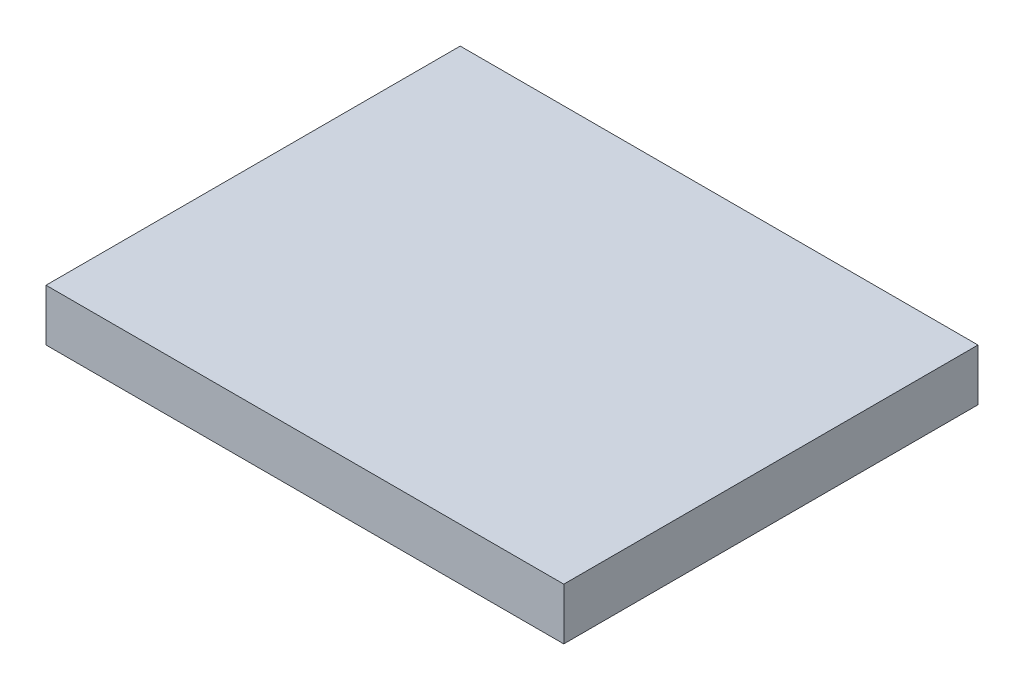
ISO-10303-21;
HEADER;
FILE_DESCRIPTION(('STEP AP214'),'2;1');
FILE_NAME('part.step','',(''),(''),'','','');
FILE_SCHEMA(('AUTOMOTIVE_DESIGN { 1 0 10303 214 1 1 1 1 }'));
ENDSEC;
DATA;
#1=APPLICATION_CONTEXT('core data for automotive mechanical design processes');
#2=APPLICATION_PROTOCOL_DEFINITION('international standard','automotive_design',2000,#1);
#3=PRODUCT_CONTEXT('',#1,'mechanical');
#4=PRODUCT('Part','Part','',(#3));
#5=PRODUCT_RELATED_PRODUCT_CATEGORY('part','',(#4));
#6=PRODUCT_DEFINITION_FORMATION('','',#4);
#7=PRODUCT_DEFINITION_CONTEXT('part definition',#1,'design');
#8=PRODUCT_DEFINITION('design','',#6,#7);
#9=PRODUCT_DEFINITION_SHAPE('','',#8);
#10=(LENGTH_UNIT() NAMED_UNIT(*) SI_UNIT(.MILLI.,.METRE.));
#11=(NAMED_UNIT(*) PLANE_ANGLE_UNIT() SI_UNIT($,.RADIAN.));
#12=(NAMED_UNIT(*) SI_UNIT($,.STERADIAN.) SOLID_ANGLE_UNIT());
#13=UNCERTAINTY_MEASURE_WITH_UNIT(LENGTH_MEASURE(1.E-05),#10,'distance_accuracy_value','');
#14=(GEOMETRIC_REPRESENTATION_CONTEXT(3) GLOBAL_UNCERTAINTY_ASSIGNED_CONTEXT((#13)) GLOBAL_UNIT_ASSIGNED_CONTEXT((#10,
#11,#12)) REPRESENTATION_CONTEXT('',''));
#15=CARTESIAN_POINT('',(0.,0.,0.));
#16=DIRECTION('',(0.,0.,1.));
#17=DIRECTION('',(1.,0.,0.));
#18=AXIS2_PLACEMENT_3D('',#15,#16,#17);
#19=CARTESIAN_POINT('',(0.,5.,0.));
#20=DIRECTION('',(-1.,0.,0.));
#21=DIRECTION('',(0.,0.,1.));
#22=AXIS2_PLACEMENT_3D('',#19,#20,#21);
#23=PLANE('',#22);
#24=DIRECTION('',(0.,0.,-1.));
#25=VECTOR('',#24,1.);
#26=CARTESIAN_POINT('',(0.,0.,0.));
#27=LINE('',#26,#25);
#28=CARTESIAN_POINT('',(0.,0.,0.));
#29=VERTEX_POINT('',#28);
#30=CARTESIAN_POINT('',(0.,0.,-40.));
#31=VERTEX_POINT('',#30);
#32=EDGE_CURVE('E96',#29,#31,#27,.T.);
#33=ORIENTED_EDGE('',*,*,#32,.T.);
#34=DIRECTION('',(0.,-1.,0.));
#35=VECTOR('',#34,1.);
#36=CARTESIAN_POINT('',(0.,5.,-40.));
#37=LINE('',#36,#35);
#38=CARTESIAN_POINT('',(0.,5.,-40.));
#39=VERTEX_POINT('',#38);
#40=EDGE_CURVE('E11',#39,#31,#37,.T.);
#41=ORIENTED_EDGE('',*,*,#40,.F.);
#42=DIRECTION('',(0.,0.,-1.));
#43=VECTOR('',#42,1.);
#44=CARTESIAN_POINT('',(0.,5.,0.));
#45=LINE('',#44,#43);
#46=CARTESIAN_POINT('',(0.,5.,0.));
#47=VERTEX_POINT('',#46);
#48=EDGE_CURVE('E84',#47,#39,#45,.T.);
#49=ORIENTED_EDGE('',*,*,#48,.F.);
#50=DIRECTION('',(0.,-1.,0.));
#51=VECTOR('',#50,1.);
#52=CARTESIAN_POINT('',(0.,5.,0.));
#53=LINE('',#52,#51);
#54=EDGE_CURVE('E92',#47,#29,#53,.T.);
#55=ORIENTED_EDGE('',*,*,#54,.T.);
#56=EDGE_LOOP('',(#33,#41,#49,#55));
#57=FACE_BOUND('',#56,.T.);
#58=ADVANCED_FACE('F33',(#57),#23,.F.);
#59=CARTESIAN_POINT('',(0.,5.,-40.));
#60=DIRECTION('',(0.,0.,1.));
#61=DIRECTION('',(1.,0.,0.));
#62=AXIS2_PLACEMENT_3D('',#59,#60,#61);
#63=PLANE('',#62);
#64=DIRECTION('',(-1.,0.,0.));
#65=VECTOR('',#64,1.);
#66=CARTESIAN_POINT('',(0.,0.,-40.));
#67=LINE('',#66,#65);
#68=CARTESIAN_POINT('',(-50.,0.,-40.));
#69=VERTEX_POINT('',#68);
#70=EDGE_CURVE('E88',#31,#69,#67,.T.);
#71=ORIENTED_EDGE('',*,*,#70,.T.);
#72=DIRECTION('',(0.,-1.,0.));
#73=VECTOR('',#72,1.);
#74=CARTESIAN_POINT('',(-50.,5.,-40.));
#75=LINE('',#74,#73);
#76=CARTESIAN_POINT('',(-50.,5.,-40.));
#77=VERTEX_POINT('',#76);
#78=EDGE_CURVE('E41',#77,#69,#75,.T.);
#79=ORIENTED_EDGE('',*,*,#78,.F.);
#80=DIRECTION('',(-1.,0.,0.));
#81=VECTOR('',#80,1.);
#82=CARTESIAN_POINT('',(0.,5.,-40.));
#83=LINE('',#82,#81);
#84=EDGE_CURVE('E79',#39,#77,#83,.T.);
#85=ORIENTED_EDGE('',*,*,#84,.F.);
#86=ORIENTED_EDGE('',*,*,#40,.T.);
#87=EDGE_LOOP('',(#71,#79,#85,#86));
#88=FACE_BOUND('',#87,.T.);
#89=ADVANCED_FACE('F87',(#88),#63,.F.);
#90=CARTESIAN_POINT('',(-50.,5.,0.));
#91=DIRECTION('',(1.,0.,0.));
#92=DIRECTION('',(0.,0.,-1.));
#93=AXIS2_PLACEMENT_3D('',#90,#91,#92);
#94=PLANE('',#93);
#95=DIRECTION('',(0.,0.,1.));
#96=VECTOR('',#95,1.);
#97=CARTESIAN_POINT('',(-50.,0.,0.));
#98=LINE('',#97,#96);
#99=CARTESIAN_POINT('',(-50.,0.,0.));
#100=VERTEX_POINT('',#99);
#101=EDGE_CURVE('E66',#69,#100,#98,.T.);
#102=ORIENTED_EDGE('',*,*,#101,.T.);
#103=DIRECTION('',(0.,-1.,0.));
#104=VECTOR('',#103,1.);
#105=CARTESIAN_POINT('',(-50.,5.,0.));
#106=LINE('',#105,#104);
#107=CARTESIAN_POINT('',(-50.,5.,0.));
#108=VERTEX_POINT('',#107);
#109=EDGE_CURVE('E89',#108,#100,#106,.T.);
#110=ORIENTED_EDGE('',*,*,#109,.F.);
#111=DIRECTION('',(0.,0.,1.));
#112=VECTOR('',#111,1.);
#113=CARTESIAN_POINT('',(-50.,5.,0.));
#114=LINE('',#113,#112);
#115=EDGE_CURVE('E82',#77,#108,#114,.T.);
#116=ORIENTED_EDGE('',*,*,#115,.F.);
#117=ORIENTED_EDGE('',*,*,#78,.T.);
#118=EDGE_LOOP('',(#102,#110,#116,#117));
#119=FACE_BOUND('',#118,.T.);
#120=ADVANCED_FACE('F90',(#119),#94,.F.);
#121=CARTESIAN_POINT('',(0.,5.,0.));
#122=DIRECTION('',(0.,0.,-1.));
#123=DIRECTION('',(-1.,0.,0.));
#124=AXIS2_PLACEMENT_3D('',#121,#122,#123);
#125=PLANE('',#124);
#126=DIRECTION('',(1.,0.,0.));
#127=VECTOR('',#126,1.);
#128=CARTESIAN_POINT('',(0.,0.,0.));
#129=LINE('',#128,#127);
#130=EDGE_CURVE('E72',#100,#29,#129,.T.);
#131=ORIENTED_EDGE('',*,*,#130,.T.);
#132=ORIENTED_EDGE('',*,*,#54,.F.);
#133=DIRECTION('',(1.,0.,0.));
#134=VECTOR('',#133,1.);
#135=CARTESIAN_POINT('',(0.,5.,0.));
#136=LINE('',#135,#134);
#137=EDGE_CURVE('E49',#108,#47,#136,.T.);
#138=ORIENTED_EDGE('',*,*,#137,.F.);
#139=ORIENTED_EDGE('',*,*,#109,.T.);
#140=EDGE_LOOP('',(#131,#132,#138,#139));
#141=FACE_BOUND('',#140,.T.);
#142=ADVANCED_FACE('F103',(#141),#125,.F.);
#143=CARTESIAN_POINT('',(0.,5.,0.));
#144=DIRECTION('',(0.,1.,0.));
#145=DIRECTION('',(0.,0.,1.));
#146=AXIS2_PLACEMENT_3D('',#143,#144,#145);
#147=PLANE('',#146);
#148=ORIENTED_EDGE('',*,*,#48,.T.);
#149=ORIENTED_EDGE('',*,*,#84,.T.);
#150=ORIENTED_EDGE('',*,*,#115,.T.);
#151=ORIENTED_EDGE('',*,*,#137,.T.);
#152=EDGE_LOOP('',(#148,#149,#150,#151));
#153=FACE_BOUND('',#152,.T.);
#154=ADVANCED_FACE('F80',(#153),#147,.T.);
#155=CARTESIAN_POINT('',(0.,0.,0.));
#156=DIRECTION('',(0.,1.,0.));
#157=DIRECTION('',(0.,0.,1.));
#158=AXIS2_PLACEMENT_3D('',#155,#156,#157);
#159=PLANE('',#158);
#160=ORIENTED_EDGE('',*,*,#32,.F.);
#161=ORIENTED_EDGE('',*,*,#130,.F.);
#162=ORIENTED_EDGE('',*,*,#101,.F.);
#163=ORIENTED_EDGE('',*,*,#70,.F.);
#164=EDGE_LOOP('',(#160,#161,#162,#163));
#165=FACE_BOUND('',#164,.T.);
#166=ADVANCED_FACE('F106',(#165),#159,.F.);
#167=CLOSED_SHELL('',(#58,#89,#120,#142,#154,#166));
#168=MANIFOLD_SOLID_BREP('B2',#167);
#169=ADVANCED_BREP_SHAPE_REPRESENTATION('',(#18,#168),#14);
#170=SHAPE_DEFINITION_REPRESENTATION(#9,#169);
ENDSEC;
END-ISO-10303-21;
